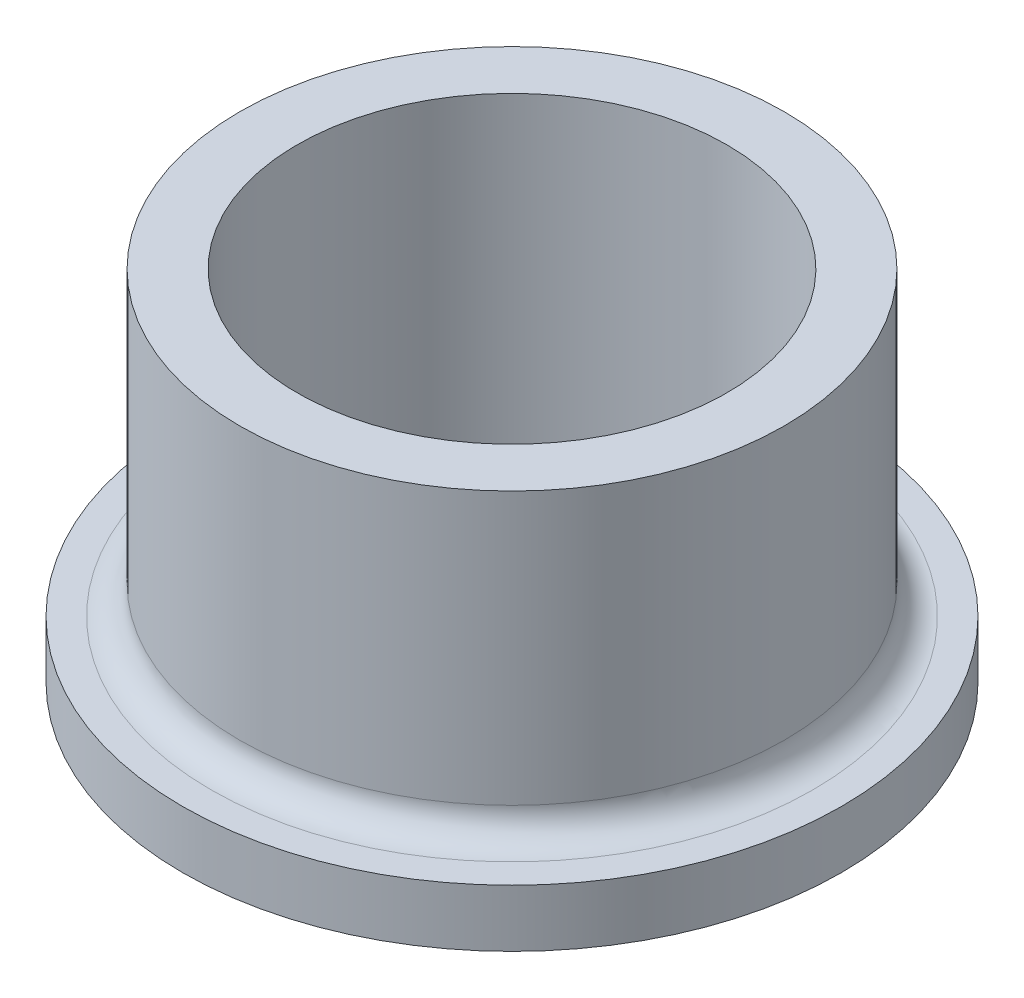
ISO-10303-21;
HEADER;
FILE_DESCRIPTION(('STEP AP214'),'2;1');
FILE_NAME('part.step','',(''),(''),'','','');
FILE_SCHEMA(('AUTOMOTIVE_DESIGN { 1 0 10303 214 1 1 1 1 }'));
ENDSEC;
DATA;
#1=APPLICATION_CONTEXT('core data for automotive mechanical design processes');
#2=APPLICATION_PROTOCOL_DEFINITION('international standard','automotive_design',2000,#1);
#3=PRODUCT_CONTEXT('',#1,'mechanical');
#4=PRODUCT('Part','Part','',(#3));
#5=PRODUCT_RELATED_PRODUCT_CATEGORY('part','',(#4));
#6=PRODUCT_DEFINITION_FORMATION('','',#4);
#7=PRODUCT_DEFINITION_CONTEXT('part definition',#1,'design');
#8=PRODUCT_DEFINITION('design','',#6,#7);
#9=PRODUCT_DEFINITION_SHAPE('','',#8);
#10=(LENGTH_UNIT() NAMED_UNIT(*) SI_UNIT(.MILLI.,.METRE.));
#11=(NAMED_UNIT(*) PLANE_ANGLE_UNIT() SI_UNIT($,.RADIAN.));
#12=(NAMED_UNIT(*) SI_UNIT($,.STERADIAN.) SOLID_ANGLE_UNIT());
#13=UNCERTAINTY_MEASURE_WITH_UNIT(LENGTH_MEASURE(1.E-05),#10,'distance_accuracy_value','');
#14=(GEOMETRIC_REPRESENTATION_CONTEXT(3) GLOBAL_UNCERTAINTY_ASSIGNED_CONTEXT((#13)) GLOBAL_UNIT_ASSIGNED_CONTEXT((#10,
#11,#12)) REPRESENTATION_CONTEXT('',''));
#15=CARTESIAN_POINT('',(0.,0.,0.));
#16=DIRECTION('',(0.,0.,1.));
#17=DIRECTION('',(1.,0.,0.));
#18=AXIS2_PLACEMENT_3D('',#15,#16,#17);
#19=CARTESIAN_POINT('',(19.,25.,0.));
#20=DIRECTION('',(0.,1.,0.));
#21=DIRECTION('',(0.,0.,1.));
#22=AXIS2_PLACEMENT_3D('',#19,#20,#21);
#23=PLANE('',#22);
#24=CARTESIAN_POINT('',(0.,25.,0.));
#25=DIRECTION('',(0.,-1.,0.));
#26=DIRECTION('',(0.,0.,-1.));
#27=AXIS2_PLACEMENT_3D('',#24,#25,#26);
#28=CIRCLE('',#27,15.);
#29=CARTESIAN_POINT('',(0.,25.,-15.));
#30=VERTEX_POINT('',#29);
#31=EDGE_CURVE('E10',#30,#30,#28,.T.);
#32=ORIENTED_EDGE('',*,*,#31,.T.);
#33=EDGE_LOOP('',(#32));
#34=FACE_BOUND('',#33,.T.);
#35=CARTESIAN_POINT('',(0.,25.,0.));
#36=DIRECTION('',(0.,-1.,0.));
#37=DIRECTION('',(0.,0.,-1.));
#38=AXIS2_PLACEMENT_3D('',#35,#36,#37);
#39=CIRCLE('',#38,19.);
#40=CARTESIAN_POINT('',(0.,25.,-19.));
#41=VERTEX_POINT('',#40);
#42=EDGE_CURVE('E59',#41,#41,#39,.T.);
#43=ORIENTED_EDGE('',*,*,#42,.F.);
#44=EDGE_LOOP('',(#43));
#45=FACE_BOUND('',#44,.T.);
#46=ADVANCED_FACE('F31',(#34,#45),#23,.T.);
#47=CARTESIAN_POINT('',(0.,0.,0.));
#48=DIRECTION('',(0.,-1.,0.));
#49=DIRECTION('',(0.,0.,-1.));
#50=AXIS2_PLACEMENT_3D('',#47,#48,#49);
#51=CYLINDRICAL_SURFACE('',#50,15.);
#52=CARTESIAN_POINT('',(0.,2.00000000000001,0.));
#53=DIRECTION('',(0.,-1.,0.));
#54=DIRECTION('',(0.,0.,-1.));
#55=AXIS2_PLACEMENT_3D('',#52,#53,#54);
#56=CIRCLE('',#55,15.);
#57=CARTESIAN_POINT('',(0.,2.00000000000001,-15.));
#58=VERTEX_POINT('',#57);
#59=EDGE_CURVE('E37',#58,#58,#56,.T.);
#60=ORIENTED_EDGE('',*,*,#59,.T.);
#61=EDGE_LOOP('',(#60));
#62=FACE_BOUND('',#61,.T.);
#63=ORIENTED_EDGE('',*,*,#31,.F.);
#64=EDGE_LOOP('',(#63));
#65=FACE_BOUND('',#64,.T.);
#66=ADVANCED_FACE('F67',(#62,#65),#51,.F.);
#67=CARTESIAN_POINT('',(0.,2.,0.));
#68=DIRECTION('',(0.,-1.,0.));
#69=DIRECTION('',(0.,0.,-1.));
#70=AXIS2_PLACEMENT_3D('',#67,#68,#69);
#71=TOROIDAL_SURFACE('',#70,17.,2.);
#72=CARTESIAN_POINT('',(0.,0.,0.));
#73=DIRECTION('',(0.,-1.,0.));
#74=DIRECTION('',(0.,0.,-1.));
#75=AXIS2_PLACEMENT_3D('',#72,#73,#74);
#76=CIRCLE('',#75,17.);
#77=CARTESIAN_POINT('',(0.,0.,-17.));
#78=VERTEX_POINT('',#77);
#79=EDGE_CURVE('E41',#78,#78,#76,.T.);
#80=ORIENTED_EDGE('',*,*,#79,.T.);
#81=EDGE_LOOP('',(#80));
#82=FACE_BOUND('',#81,.T.);
#83=ORIENTED_EDGE('',*,*,#59,.F.);
#84=EDGE_LOOP('',(#83));
#85=FACE_BOUND('',#84,.T.);
#86=ADVANCED_FACE('F71',(#82,#85),#71,.T.);
#87=CARTESIAN_POINT('',(17.,0.,0.));
#88=DIRECTION('',(0.,-1.,0.));
#89=DIRECTION('',(0.,0.,-1.));
#90=AXIS2_PLACEMENT_3D('',#87,#88,#89);
#91=PLANE('',#90);
#92=CARTESIAN_POINT('',(0.,0.,0.));
#93=DIRECTION('',(0.,-1.,0.));
#94=DIRECTION('',(0.,0.,-1.));
#95=AXIS2_PLACEMENT_3D('',#92,#93,#94);
#96=CIRCLE('',#95,23.);
#97=CARTESIAN_POINT('',(0.,0.,-23.));
#98=VERTEX_POINT('',#97);
#99=EDGE_CURVE('E45',#98,#98,#96,.T.);
#100=ORIENTED_EDGE('',*,*,#99,.T.);
#101=EDGE_LOOP('',(#100));
#102=FACE_BOUND('',#101,.T.);
#103=ORIENTED_EDGE('',*,*,#79,.F.);
#104=EDGE_LOOP('',(#103));
#105=FACE_BOUND('',#104,.T.);
#106=ADVANCED_FACE('F75',(#102,#105),#91,.T.);
#107=CARTESIAN_POINT('',(0.,0.,0.));
#108=DIRECTION('',(0.,-1.,0.));
#109=DIRECTION('',(0.,0.,-1.));
#110=AXIS2_PLACEMENT_3D('',#107,#108,#109);
#111=CYLINDRICAL_SURFACE('',#110,23.);
#112=CARTESIAN_POINT('',(0.,4.,0.));
#113=DIRECTION('',(0.,-1.,0.));
#114=DIRECTION('',(0.,0.,-1.));
#115=AXIS2_PLACEMENT_3D('',#112,#113,#114);
#116=CIRCLE('',#115,23.);
#117=CARTESIAN_POINT('',(0.,4.,-23.));
#118=VERTEX_POINT('',#117);
#119=EDGE_CURVE('E50',#118,#118,#116,.T.);
#120=ORIENTED_EDGE('',*,*,#119,.T.);
#121=EDGE_LOOP('',(#120));
#122=FACE_BOUND('',#121,.T.);
#123=ORIENTED_EDGE('',*,*,#99,.F.);
#124=EDGE_LOOP('',(#123));
#125=FACE_BOUND('',#124,.T.);
#126=ADVANCED_FACE('F82',(#122,#125),#111,.T.);
#127=CARTESIAN_POINT('',(23.,4.,0.));
#128=DIRECTION('',(0.,1.,0.));
#129=DIRECTION('',(0.,0.,1.));
#130=AXIS2_PLACEMENT_3D('',#127,#128,#129);
#131=PLANE('',#130);
#132=CARTESIAN_POINT('',(0.,4.,0.));
#133=DIRECTION('',(0.,-1.,0.));
#134=DIRECTION('',(0.,0.,-1.));
#135=AXIS2_PLACEMENT_3D('',#132,#133,#134);
#136=CIRCLE('',#135,21.);
#137=CARTESIAN_POINT('',(0.,4.,-21.));
#138=VERTEX_POINT('',#137);
#139=EDGE_CURVE('E53',#138,#138,#136,.T.);
#140=ORIENTED_EDGE('',*,*,#139,.T.);
#141=EDGE_LOOP('',(#140));
#142=FACE_BOUND('',#141,.T.);
#143=ORIENTED_EDGE('',*,*,#119,.F.);
#144=EDGE_LOOP('',(#143));
#145=FACE_BOUND('',#144,.T.);
#146=ADVANCED_FACE('F86',(#142,#145),#131,.T.);
#147=CARTESIAN_POINT('',(0.,6.,0.));
#148=DIRECTION('',(0.,-1.,0.));
#149=DIRECTION('',(0.,0.,-1.));
#150=AXIS2_PLACEMENT_3D('',#147,#148,#149);
#151=TOROIDAL_SURFACE('',#150,21.,2.);
#152=CARTESIAN_POINT('',(0.,6.,0.));
#153=DIRECTION('',(0.,-1.,0.));
#154=DIRECTION('',(0.,0.,-1.));
#155=AXIS2_PLACEMENT_3D('',#152,#153,#154);
#156=CIRCLE('',#155,19.);
#157=CARTESIAN_POINT('',(0.,6.,-19.));
#158=VERTEX_POINT('',#157);
#159=EDGE_CURVE('E56',#158,#158,#156,.T.);
#160=ORIENTED_EDGE('',*,*,#159,.T.);
#161=EDGE_LOOP('',(#160));
#162=FACE_BOUND('',#161,.T.);
#163=ORIENTED_EDGE('',*,*,#139,.F.);
#164=EDGE_LOOP('',(#163));
#165=FACE_BOUND('',#164,.T.);
#166=ADVANCED_FACE('F90',(#162,#165),#151,.F.);
#167=CARTESIAN_POINT('',(0.,0.,0.));
#168=DIRECTION('',(0.,-1.,0.));
#169=DIRECTION('',(0.,0.,-1.));
#170=AXIS2_PLACEMENT_3D('',#167,#168,#169);
#171=CYLINDRICAL_SURFACE('',#170,19.);
#172=ORIENTED_EDGE('',*,*,#42,.T.);
#173=EDGE_LOOP('',(#172));
#174=FACE_BOUND('',#173,.T.);
#175=ORIENTED_EDGE('',*,*,#159,.F.);
#176=EDGE_LOOP('',(#175));
#177=FACE_BOUND('',#176,.T.);
#178=ADVANCED_FACE('F63',(#174,#177),#171,.T.);
#179=CLOSED_SHELL('',(#46,#66,#86,#106,#126,#146,#166,#178));
#180=MANIFOLD_SOLID_BREP('B2',#179);
#181=ADVANCED_BREP_SHAPE_REPRESENTATION('',(#18,#180),#14);
#182=SHAPE_DEFINITION_REPRESENTATION(#9,#181);
ENDSEC;
END-ISO-10303-21;
